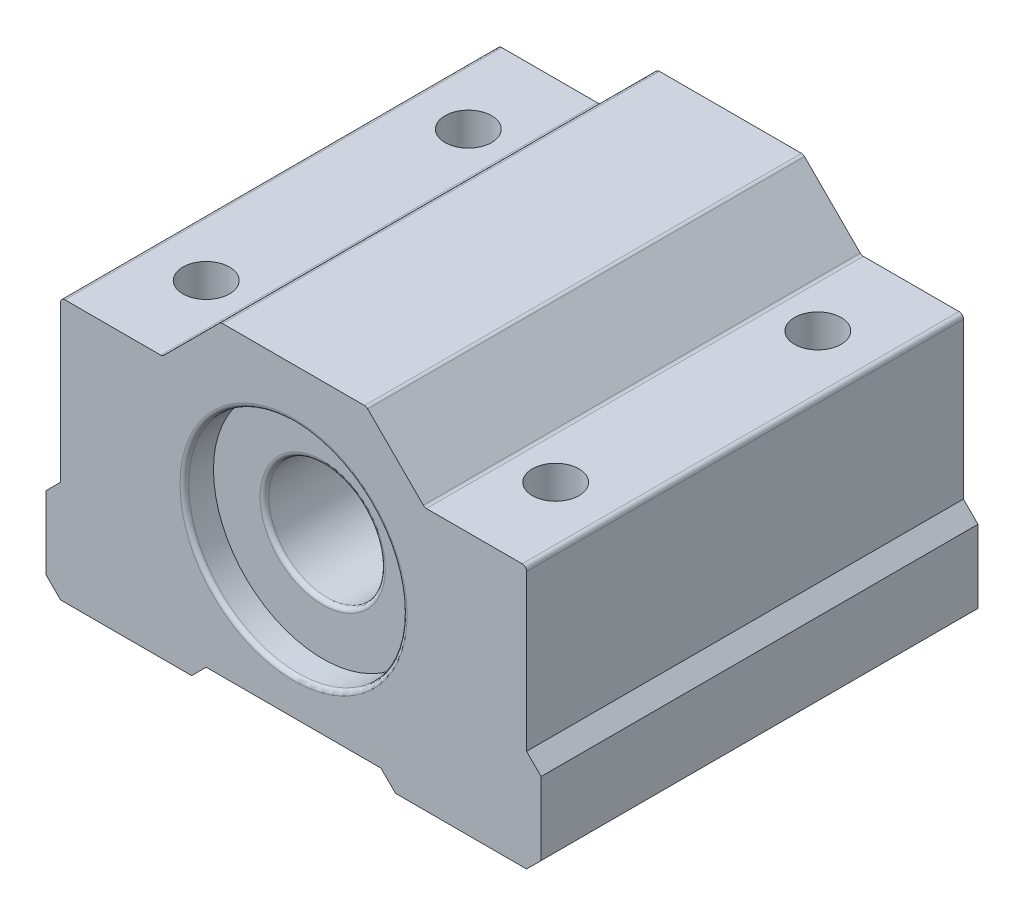
ISO-10303-21;
HEADER;
FILE_DESCRIPTION(('STEP AP214'),'2;1');
FILE_NAME('part.step','',(''),(''),'','','');
FILE_SCHEMA(('AUTOMOTIVE_DESIGN { 1 0 10303 214 1 1 1 1 }'));
ENDSEC;
DATA;
#1=APPLICATION_CONTEXT('core data for automotive mechanical design processes');
#2=APPLICATION_PROTOCOL_DEFINITION('international standard','automotive_design',2000,#1);
#3=PRODUCT_CONTEXT('',#1,'mechanical');
#4=PRODUCT('Part','Part','',(#3));
#5=PRODUCT_RELATED_PRODUCT_CATEGORY('part','',(#4));
#6=PRODUCT_DEFINITION_FORMATION('','',#4);
#7=PRODUCT_DEFINITION_CONTEXT('part definition',#1,'design');
#8=PRODUCT_DEFINITION('design','',#6,#7);
#9=PRODUCT_DEFINITION_SHAPE('','',#8);
#10=(LENGTH_UNIT() NAMED_UNIT(*) SI_UNIT(.MILLI.,.METRE.));
#11=(NAMED_UNIT(*) PLANE_ANGLE_UNIT() SI_UNIT($,.RADIAN.));
#12=(NAMED_UNIT(*) SI_UNIT($,.STERADIAN.) SOLID_ANGLE_UNIT());
#13=UNCERTAINTY_MEASURE_WITH_UNIT(LENGTH_MEASURE(1.E-05),#10,'distance_accuracy_value','');
#14=(GEOMETRIC_REPRESENTATION_CONTEXT(3) GLOBAL_UNCERTAINTY_ASSIGNED_CONTEXT((#13)) GLOBAL_UNIT_ASSIGNED_CONTEXT((#10,
#11,#12)) REPRESENTATION_CONTEXT('',''));
#15=CARTESIAN_POINT('',(0.,0.,0.));
#16=DIRECTION('',(0.,0.,1.));
#17=DIRECTION('',(1.,0.,0.));
#18=AXIS2_PLACEMENT_3D('',#15,#16,#17);
#19=CARTESIAN_POINT('',(0.,11.,15.));
#20=DIRECTION('',(0.,0.,-1.));
#21=DIRECTION('',(-1.,0.,0.));
#22=AXIS2_PLACEMENT_3D('',#19,#20,#21);
#23=CYLINDRICAL_SURFACE('',#22,4.);
#24=CARTESIAN_POINT('',(0.,11.,-12.7));
#25=DIRECTION('',(0.,0.,-1.));
#26=DIRECTION('',(-1.,0.,0.));
#27=AXIS2_PLACEMENT_3D('',#24,#25,#26);
#28=CIRCLE('',#27,4.);
#29=CARTESIAN_POINT('',(-4.,11.,-12.7));
#30=VERTEX_POINT('',#29);
#31=EDGE_CURVE('E356',#30,#30,#28,.T.);
#32=ORIENTED_EDGE('',*,*,#31,.T.);
#33=EDGE_LOOP('',(#32));
#34=FACE_BOUND('',#33,.T.);
#35=CARTESIAN_POINT('',(0.,11.,12.7));
#36=DIRECTION('',(0.,0.,1.));
#37=DIRECTION('',(1.,0.,0.));
#38=AXIS2_PLACEMENT_3D('',#35,#36,#37);
#39=CIRCLE('',#38,4.);
#40=CARTESIAN_POINT('',(4.,11.,12.7));
#41=VERTEX_POINT('',#40);
#42=EDGE_CURVE('E353',#41,#41,#39,.T.);
#43=ORIENTED_EDGE('',*,*,#42,.T.);
#44=EDGE_LOOP('',(#43));
#45=FACE_BOUND('',#44,.T.);
#46=ADVANCED_FACE('F34',(#34,#45),#23,.F.);
#47=CARTESIAN_POINT('',(0.,0.,15.));
#48=DIRECTION('',(0.,0.,1.));
#49=DIRECTION('',(1.,0.,0.));
#50=AXIS2_PLACEMENT_3D('',#47,#48,#49);
#51=PLANE('',#50);
#52=CARTESIAN_POINT('',(0.,11.,15.));
#53=DIRECTION('',(0.,0.,1.));
#54=DIRECTION('',(1.,0.,0.));
#55=AXIS2_PLACEMENT_3D('',#52,#53,#54);
#56=CIRCLE('',#55,7.8);
#57=CARTESIAN_POINT('',(7.8,11.,15.));
#58=VERTEX_POINT('',#57);
#59=EDGE_CURVE('E372',#58,#58,#56,.F.);
#60=ORIENTED_EDGE('',*,*,#59,.T.);
#61=EDGE_LOOP('',(#60));
#62=FACE_BOUND('',#61,.T.);
#63=DIRECTION('',(-0.707106781186548,0.707106781186547,0.));
#64=VECTOR('',#63,1.);
#65=CARTESIAN_POINT('',(9.,18.,15.));
#66=LINE('',#65,#64);
#67=CARTESIAN_POINT('',(8.91213203435596,18.087867965644,15.));
#68=VERTEX_POINT('',#67);
#69=CARTESIAN_POINT('',(5.08786796564404,21.912132034356,15.));
#70=VERTEX_POINT('',#69);
#71=EDGE_CURVE('E231',#68,#70,#66,.T.);
#72=ORIENTED_EDGE('',*,*,#71,.T.);
#73=CARTESIAN_POINT('',(4.87573593128807,21.7,15.));
#74=DIRECTION('',(0.,0.,1.));
#75=DIRECTION('',(1.,0.,0.));
#76=AXIS2_PLACEMENT_3D('',#73,#74,#75);
#77=CIRCLE('',#76,0.3);
#78=CARTESIAN_POINT('',(4.87573593128807,22.,15.));
#79=VERTEX_POINT('',#78);
#80=EDGE_CURVE('E370',#70,#79,#77,.T.);
#81=ORIENTED_EDGE('',*,*,#80,.T.);
#82=DIRECTION('',(-1.,0.,0.));
#83=VECTOR('',#82,1.);
#84=CARTESIAN_POINT('',(-5.,22.,15.));
#85=LINE('',#84,#83);
#86=CARTESIAN_POINT('',(-4.87573593128808,22.,15.));
#87=VERTEX_POINT('',#86);
#88=EDGE_CURVE('E233',#79,#87,#85,.T.);
#89=ORIENTED_EDGE('',*,*,#88,.T.);
#90=CARTESIAN_POINT('',(-4.87573593128808,21.7,15.));
#91=DIRECTION('',(0.,0.,1.));
#92=DIRECTION('',(1.,0.,0.));
#93=AXIS2_PLACEMENT_3D('',#90,#91,#92);
#94=CIRCLE('',#93,0.3);
#95=CARTESIAN_POINT('',(-5.08786796564404,21.912132034356,15.));
#96=VERTEX_POINT('',#95);
#97=EDGE_CURVE('E368',#87,#96,#94,.T.);
#98=ORIENTED_EDGE('',*,*,#97,.T.);
#99=DIRECTION('',(-0.707106781186547,-0.707106781186548,0.));
#100=VECTOR('',#99,1.);
#101=CARTESIAN_POINT('',(-9.,18.,15.));
#102=LINE('',#101,#100);
#103=CARTESIAN_POINT('',(-8.91213203435596,18.087867965644,15.));
#104=VERTEX_POINT('',#103);
#105=EDGE_CURVE('E236',#96,#104,#102,.T.);
#106=ORIENTED_EDGE('',*,*,#105,.T.);
#107=CARTESIAN_POINT('',(-9.12426406871193,18.3,15.));
#108=DIRECTION('',(0.,0.,1.));
#109=DIRECTION('',(1.,0.,0.));
#110=AXIS2_PLACEMENT_3D('',#107,#108,#109);
#111=CIRCLE('',#110,0.3);
#112=CARTESIAN_POINT('',(-9.12426406871193,18.,15.));
#113=VERTEX_POINT('',#112);
#114=EDGE_CURVE('E409',#104,#113,#111,.F.);
#115=ORIENTED_EDGE('',*,*,#114,.T.);
#116=DIRECTION('',(-1.,0.,0.));
#117=VECTOR('',#116,1.);
#118=CARTESIAN_POINT('',(-16.,18.,15.));
#119=LINE('',#118,#117);
#120=CARTESIAN_POINT('',(-15.7,18.,15.));
#121=VERTEX_POINT('',#120);
#122=EDGE_CURVE('E239',#113,#121,#119,.T.);
#123=ORIENTED_EDGE('',*,*,#122,.T.);
#124=CARTESIAN_POINT('',(-15.7,17.7,15.));
#125=DIRECTION('',(0.,0.,1.));
#126=DIRECTION('',(1.,0.,0.));
#127=AXIS2_PLACEMENT_3D('',#124,#125,#126);
#128=CIRCLE('',#127,0.3);
#129=CARTESIAN_POINT('',(-16.,17.7,15.));
#130=VERTEX_POINT('',#129);
#131=EDGE_CURVE('E49',#121,#130,#128,.T.);
#132=ORIENTED_EDGE('',*,*,#131,.T.);
#133=DIRECTION('',(0.,-1.,0.));
#134=VECTOR('',#133,1.);
#135=CARTESIAN_POINT('',(-16.,7.,15.));
#136=LINE('',#135,#134);
#137=CARTESIAN_POINT('',(-16.,7.,15.));
#138=VERTEX_POINT('',#137);
#139=EDGE_CURVE('E241',#130,#138,#136,.T.);
#140=ORIENTED_EDGE('',*,*,#139,.T.);
#141=DIRECTION('',(-0.707106781186547,-0.707106781186547,0.));
#142=VECTOR('',#141,1.);
#143=CARTESIAN_POINT('',(-17.,6.,15.));
#144=LINE('',#143,#142);
#145=CARTESIAN_POINT('',(-17.,6.,15.));
#146=VERTEX_POINT('',#145);
#147=EDGE_CURVE('E243',#138,#146,#144,.T.);
#148=ORIENTED_EDGE('',*,*,#147,.T.);
#149=DIRECTION('',(0.,-1.,0.));
#150=VECTOR('',#149,1.);
#151=CARTESIAN_POINT('',(-17.,0.,15.));
#152=LINE('',#151,#150);
#153=CARTESIAN_POINT('',(-17.,0.999999999999999,15.));
#154=VERTEX_POINT('',#153);
#155=EDGE_CURVE('E245',#146,#154,#152,.T.);
#156=ORIENTED_EDGE('',*,*,#155,.T.);
#157=DIRECTION('',(-0.707106781186548,0.707106781186548,0.));
#158=VECTOR('',#157,1.);
#159=CARTESIAN_POINT('',(-8.,-8.,15.));
#160=LINE('',#159,#158);
#161=CARTESIAN_POINT('',(-16.,0.,15.));
#162=VERTEX_POINT('',#161);
#163=EDGE_CURVE('E331',#154,#162,#160,.F.);
#164=ORIENTED_EDGE('',*,*,#163,.T.);
#165=DIRECTION('',(1.,0.,0.));
#166=VECTOR('',#165,1.);
#167=CARTESIAN_POINT('',(-7.,0.,15.));
#168=LINE('',#167,#166);
#169=CARTESIAN_POINT('',(-7.,0.,15.));
#170=VERTEX_POINT('',#169);
#171=EDGE_CURVE('E248',#162,#170,#168,.T.);
#172=ORIENTED_EDGE('',*,*,#171,.T.);
#173=DIRECTION('',(0.707106781186547,0.707106781186548,0.));
#174=VECTOR('',#173,1.);
#175=CARTESIAN_POINT('',(-6.,1.,15.));
#176=LINE('',#175,#174);
#177=CARTESIAN_POINT('',(-6.,1.,15.));
#178=VERTEX_POINT('',#177);
#179=EDGE_CURVE('E250',#170,#178,#176,.T.);
#180=ORIENTED_EDGE('',*,*,#179,.T.);
#181=DIRECTION('',(1.,0.,0.));
#182=VECTOR('',#181,1.);
#183=CARTESIAN_POINT('',(6.,1.,15.));
#184=LINE('',#183,#182);
#185=CARTESIAN_POINT('',(6.,1.,15.));
#186=VERTEX_POINT('',#185);
#187=EDGE_CURVE('E252',#178,#186,#184,.T.);
#188=ORIENTED_EDGE('',*,*,#187,.T.);
#189=DIRECTION('',(0.707106781186545,-0.70710678118655,0.));
#190=VECTOR('',#189,1.);
#191=CARTESIAN_POINT('',(6.,1.,15.));
#192=LINE('',#191,#190);
#193=CARTESIAN_POINT('',(7.,0.,15.));
#194=VERTEX_POINT('',#193);
#195=EDGE_CURVE('E254',#186,#194,#192,.T.);
#196=ORIENTED_EDGE('',*,*,#195,.T.);
#197=DIRECTION('',(1.,0.,0.));
#198=VECTOR('',#197,1.);
#199=CARTESIAN_POINT('',(7.,0.,15.));
#200=LINE('',#199,#198);
#201=CARTESIAN_POINT('',(16.,0.,15.));
#202=VERTEX_POINT('',#201);
#203=EDGE_CURVE('E208',#194,#202,#200,.T.);
#204=ORIENTED_EDGE('',*,*,#203,.T.);
#205=DIRECTION('',(-0.707106781186548,-0.707106781186548,0.));
#206=VECTOR('',#205,1.);
#207=CARTESIAN_POINT('',(8.,-8.,15.));
#208=LINE('',#207,#206);
#209=CARTESIAN_POINT('',(17.,1.00000000000001,15.));
#210=VERTEX_POINT('',#209);
#211=EDGE_CURVE('E204',#202,#210,#208,.F.);
#212=ORIENTED_EDGE('',*,*,#211,.T.);
#213=DIRECTION('',(0.,1.,0.));
#214=VECTOR('',#213,1.);
#215=CARTESIAN_POINT('',(17.,0.,15.));
#216=LINE('',#215,#214);
#217=CARTESIAN_POINT('',(17.,6.,15.));
#218=VERTEX_POINT('',#217);
#219=EDGE_CURVE('E194',#210,#218,#216,.T.);
#220=ORIENTED_EDGE('',*,*,#219,.T.);
#221=DIRECTION('',(-0.707106781186547,0.707106781186547,0.));
#222=VECTOR('',#221,1.);
#223=CARTESIAN_POINT('',(17.,6.,15.));
#224=LINE('',#223,#222);
#225=CARTESIAN_POINT('',(16.,7.,15.));
#226=VERTEX_POINT('',#225);
#227=EDGE_CURVE('E200',#218,#226,#224,.T.);
#228=ORIENTED_EDGE('',*,*,#227,.T.);
#229=DIRECTION('',(0.,1.,0.));
#230=VECTOR('',#229,1.);
#231=CARTESIAN_POINT('',(16.,7.,15.));
#232=LINE('',#231,#230);
#233=CARTESIAN_POINT('',(16.,17.7,15.));
#234=VERTEX_POINT('',#233);
#235=EDGE_CURVE('E223',#226,#234,#232,.T.);
#236=ORIENTED_EDGE('',*,*,#235,.T.);
#237=CARTESIAN_POINT('',(15.7,17.7,15.));
#238=DIRECTION('',(0.,0.,1.));
#239=DIRECTION('',(1.,0.,0.));
#240=AXIS2_PLACEMENT_3D('',#237,#238,#239);
#241=CIRCLE('',#240,0.3);
#242=CARTESIAN_POINT('',(15.7,18.,15.));
#243=VERTEX_POINT('',#242);
#244=EDGE_CURVE('E366',#234,#243,#241,.T.);
#245=ORIENTED_EDGE('',*,*,#244,.T.);
#246=DIRECTION('',(-1.,0.,0.));
#247=VECTOR('',#246,1.);
#248=CARTESIAN_POINT('',(16.,18.,15.));
#249=LINE('',#248,#247);
#250=CARTESIAN_POINT('',(9.12426406871193,18.,15.));
#251=VERTEX_POINT('',#250);
#252=EDGE_CURVE('E225',#243,#251,#249,.T.);
#253=ORIENTED_EDGE('',*,*,#252,.T.);
#254=CARTESIAN_POINT('',(9.12426406871193,18.3,15.));
#255=DIRECTION('',(0.,0.,1.));
#256=DIRECTION('',(1.,0.,0.));
#257=AXIS2_PLACEMENT_3D('',#254,#255,#256);
#258=CIRCLE('',#257,0.3);
#259=EDGE_CURVE('E11',#251,#68,#258,.F.);
#260=ORIENTED_EDGE('',*,*,#259,.T.);
#261=EDGE_LOOP('',(#72,#81,#89,#98,#106,#115,#123,#132,#140,#148,#156,#164,#172,#180,#188,#196,
#204,#212,#220,#228,#236,#245,#253,#260));
#262=FACE_BOUND('',#261,.T.);
#263=ADVANCED_FACE('F197',(#62,#262),#51,.T.);
#264=CARTESIAN_POINT('',(0.,0.,-15.));
#265=DIRECTION('',(0.,0.,1.));
#266=DIRECTION('',(1.,0.,0.));
#267=AXIS2_PLACEMENT_3D('',#264,#265,#266);
#268=PLANE('',#267);
#269=CARTESIAN_POINT('',(0.,11.,-15.));
#270=DIRECTION('',(0.,0.,1.));
#271=DIRECTION('',(1.,0.,0.));
#272=AXIS2_PLACEMENT_3D('',#269,#270,#271);
#273=CIRCLE('',#272,7.8);
#274=CARTESIAN_POINT('',(7.8,11.,-15.));
#275=VERTEX_POINT('',#274);
#276=EDGE_CURVE('E350',#275,#275,#273,.T.);
#277=ORIENTED_EDGE('',*,*,#276,.T.);
#278=EDGE_LOOP('',(#277));
#279=FACE_BOUND('',#278,.T.);
#280=DIRECTION('',(-1.,0.,0.));
#281=VECTOR('',#280,1.);
#282=CARTESIAN_POINT('',(-5.,22.,-15.));
#283=LINE('',#282,#281);
#284=CARTESIAN_POINT('',(4.87573593128807,22.,-15.));
#285=VERTEX_POINT('',#284);
#286=CARTESIAN_POINT('',(-4.87573593128808,22.,-15.));
#287=VERTEX_POINT('',#286);
#288=EDGE_CURVE('E273',#285,#287,#283,.T.);
#289=ORIENTED_EDGE('',*,*,#288,.F.);
#290=CARTESIAN_POINT('',(4.87573593128807,21.7,-15.));
#291=DIRECTION('',(0.,0.,1.));
#292=DIRECTION('',(1.,0.,0.));
#293=AXIS2_PLACEMENT_3D('',#290,#291,#292);
#294=CIRCLE('',#293,0.3);
#295=CARTESIAN_POINT('',(5.08786796564404,21.912132034356,-15.));
#296=VERTEX_POINT('',#295);
#297=EDGE_CURVE('E348',#285,#296,#294,.F.);
#298=ORIENTED_EDGE('',*,*,#297,.T.);
#299=DIRECTION('',(-0.707106781186548,0.707106781186547,0.));
#300=VECTOR('',#299,1.);
#301=CARTESIAN_POINT('',(9.,18.,-15.));
#302=LINE('',#301,#300);
#303=CARTESIAN_POINT('',(8.91213203435596,18.087867965644,-15.));
#304=VERTEX_POINT('',#303);
#305=EDGE_CURVE('E270',#304,#296,#302,.T.);
#306=ORIENTED_EDGE('',*,*,#305,.F.);
#307=CARTESIAN_POINT('',(9.12426406871193,18.3,-15.));
#308=DIRECTION('',(0.,0.,1.));
#309=DIRECTION('',(1.,0.,0.));
#310=AXIS2_PLACEMENT_3D('',#307,#308,#309);
#311=CIRCLE('',#310,0.3);
#312=CARTESIAN_POINT('',(9.12426406871193,18.,-15.));
#313=VERTEX_POINT('',#312);
#314=EDGE_CURVE('E42',#304,#313,#311,.T.);
#315=ORIENTED_EDGE('',*,*,#314,.T.);
#316=DIRECTION('',(-1.,0.,0.));
#317=VECTOR('',#316,1.);
#318=CARTESIAN_POINT('',(16.,18.,-15.));
#319=LINE('',#318,#317);
#320=CARTESIAN_POINT('',(15.7,18.,-15.));
#321=VERTEX_POINT('',#320);
#322=EDGE_CURVE('E267',#321,#313,#319,.T.);
#323=ORIENTED_EDGE('',*,*,#322,.F.);
#324=CARTESIAN_POINT('',(15.7,17.7,-15.));
#325=DIRECTION('',(0.,0.,1.));
#326=DIRECTION('',(1.,0.,0.));
#327=AXIS2_PLACEMENT_3D('',#324,#325,#326);
#328=CIRCLE('',#327,0.3);
#329=CARTESIAN_POINT('',(16.,17.7,-15.));
#330=VERTEX_POINT('',#329);
#331=EDGE_CURVE('E344',#321,#330,#328,.F.);
#332=ORIENTED_EDGE('',*,*,#331,.T.);
#333=DIRECTION('',(0.,1.,0.));
#334=VECTOR('',#333,1.);
#335=CARTESIAN_POINT('',(16.,7.,-15.));
#336=LINE('',#335,#334);
#337=CARTESIAN_POINT('',(16.,7.,-15.));
#338=VERTEX_POINT('',#337);
#339=EDGE_CURVE('E264',#338,#330,#336,.T.);
#340=ORIENTED_EDGE('',*,*,#339,.F.);
#341=DIRECTION('',(-0.707106781186547,0.707106781186547,0.));
#342=VECTOR('',#341,1.);
#343=CARTESIAN_POINT('',(17.,6.,-15.));
#344=LINE('',#343,#342);
#345=CARTESIAN_POINT('',(17.,6.,-15.));
#346=VERTEX_POINT('',#345);
#347=EDGE_CURVE('E262',#346,#338,#344,.T.);
#348=ORIENTED_EDGE('',*,*,#347,.F.);
#349=DIRECTION('',(0.,1.,0.));
#350=VECTOR('',#349,1.);
#351=CARTESIAN_POINT('',(17.,0.,-15.));
#352=LINE('',#351,#350);
#353=CARTESIAN_POINT('',(17.,1.,-15.));
#354=VERTEX_POINT('',#353);
#355=EDGE_CURVE('E214',#354,#346,#352,.T.);
#356=ORIENTED_EDGE('',*,*,#355,.F.);
#357=DIRECTION('',(0.707106781186548,0.707106781186548,0.));
#358=VECTOR('',#357,1.);
#359=CARTESIAN_POINT('',(17.,1.,-15.));
#360=LINE('',#359,#358);
#361=CARTESIAN_POINT('',(16.,0.,-15.));
#362=VERTEX_POINT('',#361);
#363=EDGE_CURVE('E327',#354,#362,#360,.F.);
#364=ORIENTED_EDGE('',*,*,#363,.T.);
#365=DIRECTION('',(1.,0.,0.));
#366=VECTOR('',#365,1.);
#367=CARTESIAN_POINT('',(7.,0.,-15.));
#368=LINE('',#367,#366);
#369=CARTESIAN_POINT('',(7.,0.,-15.));
#370=VERTEX_POINT('',#369);
#371=EDGE_CURVE('E257',#370,#362,#368,.T.);
#372=ORIENTED_EDGE('',*,*,#371,.F.);
#373=DIRECTION('',(0.707106781186545,-0.70710678118655,0.));
#374=VECTOR('',#373,1.);
#375=CARTESIAN_POINT('',(6.,1.,-15.));
#376=LINE('',#375,#374);
#377=CARTESIAN_POINT('',(6.,1.,-15.));
#378=VERTEX_POINT('',#377);
#379=EDGE_CURVE('E294',#378,#370,#376,.T.);
#380=ORIENTED_EDGE('',*,*,#379,.F.);
#381=DIRECTION('',(1.,0.,0.));
#382=VECTOR('',#381,1.);
#383=CARTESIAN_POINT('',(6.,1.,-15.));
#384=LINE('',#383,#382);
#385=CARTESIAN_POINT('',(-6.,1.,-15.));
#386=VERTEX_POINT('',#385);
#387=EDGE_CURVE('E292',#386,#378,#384,.T.);
#388=ORIENTED_EDGE('',*,*,#387,.F.);
#389=DIRECTION('',(0.707106781186547,0.707106781186548,0.));
#390=VECTOR('',#389,1.);
#391=CARTESIAN_POINT('',(-6.,1.,-15.));
#392=LINE('',#391,#390);
#393=CARTESIAN_POINT('',(-7.,0.,-15.));
#394=VERTEX_POINT('',#393);
#395=EDGE_CURVE('E290',#394,#386,#392,.T.);
#396=ORIENTED_EDGE('',*,*,#395,.F.);
#397=DIRECTION('',(1.,0.,0.));
#398=VECTOR('',#397,1.);
#399=CARTESIAN_POINT('',(-7.,0.,-15.));
#400=LINE('',#399,#398);
#401=CARTESIAN_POINT('',(-16.,0.,-15.));
#402=VERTEX_POINT('',#401);
#403=EDGE_CURVE('E288',#402,#394,#400,.T.);
#404=ORIENTED_EDGE('',*,*,#403,.F.);
#405=DIRECTION('',(0.707106781186548,-0.707106781186548,0.));
#406=VECTOR('',#405,1.);
#407=CARTESIAN_POINT('',(-16.,0.,-15.));
#408=LINE('',#407,#406);
#409=CARTESIAN_POINT('',(-17.,0.999999999999999,-15.));
#410=VERTEX_POINT('',#409);
#411=EDGE_CURVE('E325',#402,#410,#408,.F.);
#412=ORIENTED_EDGE('',*,*,#411,.T.);
#413=DIRECTION('',(0.,-1.,0.));
#414=VECTOR('',#413,1.);
#415=CARTESIAN_POINT('',(-17.,0.,-15.));
#416=LINE('',#415,#414);
#417=CARTESIAN_POINT('',(-17.,6.,-15.));
#418=VERTEX_POINT('',#417);
#419=EDGE_CURVE('E285',#418,#410,#416,.T.);
#420=ORIENTED_EDGE('',*,*,#419,.F.);
#421=DIRECTION('',(-0.707106781186547,-0.707106781186547,0.));
#422=VECTOR('',#421,1.);
#423=CARTESIAN_POINT('',(-17.,6.,-15.));
#424=LINE('',#423,#422);
#425=CARTESIAN_POINT('',(-16.,7.,-15.));
#426=VERTEX_POINT('',#425);
#427=EDGE_CURVE('E283',#426,#418,#424,.T.);
#428=ORIENTED_EDGE('',*,*,#427,.F.);
#429=DIRECTION('',(0.,-1.,0.));
#430=VECTOR('',#429,1.);
#431=CARTESIAN_POINT('',(-16.,7.,-15.));
#432=LINE('',#431,#430);
#433=CARTESIAN_POINT('',(-16.,17.7,-15.));
#434=VERTEX_POINT('',#433);
#435=EDGE_CURVE('E281',#434,#426,#432,.T.);
#436=ORIENTED_EDGE('',*,*,#435,.F.);
#437=CARTESIAN_POINT('',(-15.7,17.7,-15.));
#438=DIRECTION('',(0.,0.,1.));
#439=DIRECTION('',(1.,0.,0.));
#440=AXIS2_PLACEMENT_3D('',#437,#438,#439);
#441=CIRCLE('',#440,0.3);
#442=CARTESIAN_POINT('',(-15.7,18.,-15.));
#443=VERTEX_POINT('',#442);
#444=EDGE_CURVE('E342',#434,#443,#441,.F.);
#445=ORIENTED_EDGE('',*,*,#444,.T.);
#446=DIRECTION('',(-1.,0.,0.));
#447=VECTOR('',#446,1.);
#448=CARTESIAN_POINT('',(-16.,18.,-15.));
#449=LINE('',#448,#447);
#450=CARTESIAN_POINT('',(-9.12426406871193,18.,-15.));
#451=VERTEX_POINT('',#450);
#452=EDGE_CURVE('E279',#451,#443,#449,.T.);
#453=ORIENTED_EDGE('',*,*,#452,.F.);
#454=CARTESIAN_POINT('',(-9.12426406871193,18.3,-15.));
#455=DIRECTION('',(0.,0.,1.));
#456=DIRECTION('',(1.,0.,0.));
#457=AXIS2_PLACEMENT_3D('',#454,#455,#456);
#458=CIRCLE('',#457,0.3);
#459=CARTESIAN_POINT('',(-8.91213203435596,18.087867965644,-15.));
#460=VERTEX_POINT('',#459);
#461=EDGE_CURVE('E407',#451,#460,#458,.T.);
#462=ORIENTED_EDGE('',*,*,#461,.T.);
#463=DIRECTION('',(-0.707106781186547,-0.707106781186548,0.));
#464=VECTOR('',#463,1.);
#465=CARTESIAN_POINT('',(-9.,18.,-15.));
#466=LINE('',#465,#464);
#467=CARTESIAN_POINT('',(-5.08786796564404,21.912132034356,-15.));
#468=VERTEX_POINT('',#467);
#469=EDGE_CURVE('E276',#468,#460,#466,.T.);
#470=ORIENTED_EDGE('',*,*,#469,.F.);
#471=CARTESIAN_POINT('',(-4.87573593128808,21.7,-15.));
#472=DIRECTION('',(0.,0.,1.));
#473=DIRECTION('',(1.,0.,0.));
#474=AXIS2_PLACEMENT_3D('',#471,#472,#473);
#475=CIRCLE('',#474,0.3);
#476=EDGE_CURVE('E346',#468,#287,#475,.F.);
#477=ORIENTED_EDGE('',*,*,#476,.T.);
#478=EDGE_LOOP('',(#289,#298,#306,#315,#323,#332,#340,#348,#356,#364,#372,#380,#388,#396,#404,
#412,#420,#428,#436,#445,#453,#462,#470,#477));
#479=FACE_BOUND('',#478,.T.);
#480=ADVANCED_FACE('F414',(#279,#479),#268,.F.);
#481=CARTESIAN_POINT('',(7.,0.,15.));
#482=DIRECTION('',(0.,1.,0.));
#483=DIRECTION('',(-1.,0.,0.));
#484=AXIS2_PLACEMENT_3D('',#481,#482,#483);
#485=PLANE('',#484);
#486=CARTESIAN_POINT('',(12.,0.,9.));
#487=DIRECTION('',(0.,-1.,0.));
#488=DIRECTION('',(1.,0.,0.));
#489=AXIS2_PLACEMENT_3D('',#486,#487,#488);
#490=CIRCLE('',#489,1.6);
#491=CARTESIAN_POINT('',(13.6,0.,9.));
#492=VERTEX_POINT('',#491);
#493=EDGE_CURVE('E323',#492,#492,#490,.T.);
#494=ORIENTED_EDGE('',*,*,#493,.F.);
#495=EDGE_LOOP('',(#494));
#496=FACE_BOUND('',#495,.T.);
#497=CARTESIAN_POINT('',(12.,0.,-9.));
#498=DIRECTION('',(0.,-1.,0.));
#499=DIRECTION('',(1.,0.,0.));
#500=AXIS2_PLACEMENT_3D('',#497,#498,#499);
#501=CIRCLE('',#500,1.6);
#502=CARTESIAN_POINT('',(13.6,0.,-9.));
#503=VERTEX_POINT('',#502);
#504=EDGE_CURVE('E318',#503,#503,#501,.T.);
#505=ORIENTED_EDGE('',*,*,#504,.F.);
#506=EDGE_LOOP('',(#505));
#507=FACE_BOUND('',#506,.T.);
#508=ORIENTED_EDGE('',*,*,#371,.T.);
#509=DIRECTION('',(0.,0.,1.));
#510=VECTOR('',#509,1.);
#511=CARTESIAN_POINT('',(16.,0.,15.));
#512=LINE('',#511,#510);
#513=EDGE_CURVE('E329',#362,#202,#512,.T.);
#514=ORIENTED_EDGE('',*,*,#513,.T.);
#515=ORIENTED_EDGE('',*,*,#203,.F.);
#516=DIRECTION('',(0.,0.,-1.));
#517=VECTOR('',#516,1.);
#518=CARTESIAN_POINT('',(7.,0.,15.));
#519=LINE('',#518,#517);
#520=EDGE_CURVE('E256',#194,#370,#519,.T.);
#521=ORIENTED_EDGE('',*,*,#520,.T.);
#522=EDGE_LOOP('',(#508,#514,#515,#521));
#523=FACE_BOUND('',#522,.T.);
#524=ADVANCED_FACE('F494',(#496,#507,#523),#485,.F.);
#525=CARTESIAN_POINT('',(17.,0.,15.));
#526=DIRECTION('',(-1.,0.,0.));
#527=DIRECTION('',(0.,0.,1.));
#528=AXIS2_PLACEMENT_3D('',#525,#526,#527);
#529=PLANE('',#528);
#530=ORIENTED_EDGE('',*,*,#219,.F.);
#531=DIRECTION('',(0.,0.,-1.));
#532=VECTOR('',#531,1.);
#533=CARTESIAN_POINT('',(17.,1.,15.));
#534=LINE('',#533,#532);
#535=EDGE_CURVE('E217',#210,#354,#534,.T.);
#536=ORIENTED_EDGE('',*,*,#535,.T.);
#537=ORIENTED_EDGE('',*,*,#355,.T.);
#538=DIRECTION('',(0.,0.,-1.));
#539=VECTOR('',#538,1.);
#540=CARTESIAN_POINT('',(17.,6.,15.));
#541=LINE('',#540,#539);
#542=EDGE_CURVE('E211',#218,#346,#541,.T.);
#543=ORIENTED_EDGE('',*,*,#542,.F.);
#544=EDGE_LOOP('',(#530,#536,#537,#543));
#545=FACE_BOUND('',#544,.T.);
#546=ADVANCED_FACE('F212',(#545),#529,.F.);
#547=CARTESIAN_POINT('',(17.,6.,15.));
#548=DIRECTION('',(-0.707106781186547,-0.707106781186547,0.));
#549=DIRECTION('',(0.707106781186548,-0.707106781186548,0.));
#550=AXIS2_PLACEMENT_3D('',#547,#548,#549);
#551=PLANE('',#550);
#552=ORIENTED_EDGE('',*,*,#347,.T.);
#553=DIRECTION('',(0.,0.,-1.));
#554=VECTOR('',#553,1.);
#555=CARTESIAN_POINT('',(16.,7.,15.));
#556=LINE('',#555,#554);
#557=EDGE_CURVE('E218',#226,#338,#556,.T.);
#558=ORIENTED_EDGE('',*,*,#557,.F.);
#559=ORIENTED_EDGE('',*,*,#227,.F.);
#560=ORIENTED_EDGE('',*,*,#542,.T.);
#561=EDGE_LOOP('',(#552,#558,#559,#560));
#562=FACE_BOUND('',#561,.T.);
#563=ADVANCED_FACE('F220',(#562),#551,.F.);
#564=CARTESIAN_POINT('',(16.,7.,15.));
#565=DIRECTION('',(-1.,0.,0.));
#566=DIRECTION('',(0.,0.,1.));
#567=AXIS2_PLACEMENT_3D('',#564,#565,#566);
#568=PLANE('',#567);
#569=ORIENTED_EDGE('',*,*,#339,.T.);
#570=DIRECTION('',(0.,0.,-1.));
#571=VECTOR('',#570,1.);
#572=CARTESIAN_POINT('',(16.,17.7,15.));
#573=LINE('',#572,#571);
#574=EDGE_CURVE('E402',#330,#234,#573,.F.);
#575=ORIENTED_EDGE('',*,*,#574,.T.);
#576=ORIENTED_EDGE('',*,*,#235,.F.);
#577=ORIENTED_EDGE('',*,*,#557,.T.);
#578=EDGE_LOOP('',(#569,#575,#576,#577));
#579=FACE_BOUND('',#578,.T.);
#580=ADVANCED_FACE('F821',(#579),#568,.F.);
#581=CARTESIAN_POINT('',(16.,18.,15.));
#582=DIRECTION('',(0.,-1.,0.));
#583=DIRECTION('',(0.,0.,-1.));
#584=AXIS2_PLACEMENT_3D('',#581,#582,#583);
#585=PLANE('',#584);
#586=CARTESIAN_POINT('',(12.,18.,9.));
#587=DIRECTION('',(0.,-1.,0.));
#588=DIRECTION('',(0.,0.,-1.));
#589=AXIS2_PLACEMENT_3D('',#586,#587,#588);
#590=CIRCLE('',#589,1.6);
#591=CARTESIAN_POINT('',(12.,18.,7.4));
#592=VERTEX_POINT('',#591);
#593=EDGE_CURVE('E319',#592,#592,#590,.T.);
#594=ORIENTED_EDGE('',*,*,#593,.T.);
#595=EDGE_LOOP('',(#594));
#596=FACE_BOUND('',#595,.T.);
#597=CARTESIAN_POINT('',(12.,18.,-9.));
#598=DIRECTION('',(0.,-1.,0.));
#599=DIRECTION('',(0.,0.,-1.));
#600=AXIS2_PLACEMENT_3D('',#597,#598,#599);
#601=CIRCLE('',#600,1.6);
#602=CARTESIAN_POINT('',(12.,18.,-10.6));
#603=VERTEX_POINT('',#602);
#604=EDGE_CURVE('E314',#603,#603,#601,.T.);
#605=ORIENTED_EDGE('',*,*,#604,.T.);
#606=EDGE_LOOP('',(#605));
#607=FACE_BOUND('',#606,.T.);
#608=ORIENTED_EDGE('',*,*,#322,.T.);
#609=DIRECTION('',(0.,0.,-1.));
#610=VECTOR('',#609,1.);
#611=CARTESIAN_POINT('',(9.12426406871193,18.,15.));
#612=LINE('',#611,#610);
#613=EDGE_CURVE('E400',#313,#251,#612,.F.);
#614=ORIENTED_EDGE('',*,*,#613,.T.);
#615=ORIENTED_EDGE('',*,*,#252,.F.);
#616=DIRECTION('',(0.,0.,-1.));
#617=VECTOR('',#616,1.);
#618=CARTESIAN_POINT('',(15.7,18.,15.));
#619=LINE('',#618,#617);
#620=EDGE_CURVE('E397',#243,#321,#619,.T.);
#621=ORIENTED_EDGE('',*,*,#620,.T.);
#622=EDGE_LOOP('',(#608,#614,#615,#621));
#623=FACE_BOUND('',#622,.T.);
#624=ADVANCED_FACE('F419',(#596,#607,#623),#585,.F.);
#625=CARTESIAN_POINT('',(9.,18.,15.));
#626=DIRECTION('',(-0.707106781186547,-0.707106781186548,0.));
#627=DIRECTION('',(0.707106781186548,-0.707106781186547,0.));
#628=AXIS2_PLACEMENT_3D('',#625,#626,#627);
#629=PLANE('',#628);
#630=ORIENTED_EDGE('',*,*,#305,.T.);
#631=DIRECTION('',(0.,0.,-1.));
#632=VECTOR('',#631,1.);
#633=CARTESIAN_POINT('',(5.08786796564404,21.912132034356,15.));
#634=LINE('',#633,#632);
#635=EDGE_CURVE('E386',#296,#70,#634,.F.);
#636=ORIENTED_EDGE('',*,*,#635,.T.);
#637=ORIENTED_EDGE('',*,*,#71,.F.);
#638=DIRECTION('',(0.,0.,-1.));
#639=VECTOR('',#638,1.);
#640=CARTESIAN_POINT('',(8.91213203435596,18.087867965644,-15.));
#641=LINE('',#640,#639);
#642=EDGE_CURVE('E383',#68,#304,#641,.T.);
#643=ORIENTED_EDGE('',*,*,#642,.T.);
#644=EDGE_LOOP('',(#630,#636,#637,#643));
#645=FACE_BOUND('',#644,.T.);
#646=ADVANCED_FACE('F427',(#645),#629,.F.);
#647=CARTESIAN_POINT('',(-5.,22.,15.));
#648=DIRECTION('',(0.,-1.,0.));
#649=DIRECTION('',(0.,0.,-1.));
#650=AXIS2_PLACEMENT_3D('',#647,#648,#649);
#651=PLANE('',#650);
#652=ORIENTED_EDGE('',*,*,#88,.F.);
#653=DIRECTION('',(0.,0.,-1.));
#654=VECTOR('',#653,1.);
#655=CARTESIAN_POINT('',(4.87573593128807,22.,15.));
#656=LINE('',#655,#654);
#657=EDGE_CURVE('E380',#79,#285,#656,.T.);
#658=ORIENTED_EDGE('',*,*,#657,.T.);
#659=ORIENTED_EDGE('',*,*,#288,.T.);
#660=DIRECTION('',(0.,0.,-1.));
#661=VECTOR('',#660,1.);
#662=CARTESIAN_POINT('',(-4.87573593128808,22.,15.));
#663=LINE('',#662,#661);
#664=EDGE_CURVE('E378',#287,#87,#663,.F.);
#665=ORIENTED_EDGE('',*,*,#664,.T.);
#666=EDGE_LOOP('',(#652,#658,#659,#665));
#667=FACE_BOUND('',#666,.T.);
#668=ADVANCED_FACE('F435',(#667),#651,.F.);
#669=CARTESIAN_POINT('',(-9.,18.,15.));
#670=DIRECTION('',(0.707106781186548,-0.707106781186547,0.));
#671=DIRECTION('',(0.707106781186547,0.707106781186548,0.));
#672=AXIS2_PLACEMENT_3D('',#669,#670,#671);
#673=PLANE('',#672);
#674=ORIENTED_EDGE('',*,*,#105,.F.);
#675=DIRECTION('',(0.,0.,-1.));
#676=VECTOR('',#675,1.);
#677=CARTESIAN_POINT('',(-5.08786796564404,21.912132034356,15.));
#678=LINE('',#677,#676);
#679=EDGE_CURVE('E390',#96,#468,#678,.T.);
#680=ORIENTED_EDGE('',*,*,#679,.T.);
#681=ORIENTED_EDGE('',*,*,#469,.T.);
#682=DIRECTION('',(0.,0.,-1.));
#683=VECTOR('',#682,1.);
#684=CARTESIAN_POINT('',(-8.91213203435596,18.087867965644,15.));
#685=LINE('',#684,#683);
#686=EDGE_CURVE('E388',#460,#104,#685,.F.);
#687=ORIENTED_EDGE('',*,*,#686,.T.);
#688=EDGE_LOOP('',(#674,#680,#681,#687));
#689=FACE_BOUND('',#688,.T.);
#690=ADVANCED_FACE('F443',(#689),#673,.F.);
#691=CARTESIAN_POINT('',(-16.,18.,15.));
#692=DIRECTION('',(0.,-1.,0.));
#693=DIRECTION('',(0.,0.,-1.));
#694=AXIS2_PLACEMENT_3D('',#691,#692,#693);
#695=PLANE('',#694);
#696=CARTESIAN_POINT('',(-12.,18.,9.));
#697=DIRECTION('',(0.,-1.,0.));
#698=DIRECTION('',(0.,0.,-1.));
#699=AXIS2_PLACEMENT_3D('',#696,#697,#698);
#700=CIRCLE('',#699,1.6);
#701=CARTESIAN_POINT('',(-12.,18.,7.4));
#702=VERTEX_POINT('',#701);
#703=EDGE_CURVE('E510',#702,#702,#700,.T.);
#704=ORIENTED_EDGE('',*,*,#703,.T.);
#705=EDGE_LOOP('',(#704));
#706=FACE_BOUND('',#705,.T.);
#707=CARTESIAN_POINT('',(-12.,18.,-9.));
#708=DIRECTION('',(0.,-1.,0.));
#709=DIRECTION('',(0.,0.,-1.));
#710=AXIS2_PLACEMENT_3D('',#707,#708,#709);
#711=CIRCLE('',#710,1.6);
#712=CARTESIAN_POINT('',(-12.,18.,-10.6));
#713=VERTEX_POINT('',#712);
#714=EDGE_CURVE('E503',#713,#713,#711,.T.);
#715=ORIENTED_EDGE('',*,*,#714,.T.);
#716=EDGE_LOOP('',(#715));
#717=FACE_BOUND('',#716,.T.);
#718=ORIENTED_EDGE('',*,*,#122,.F.);
#719=DIRECTION('',(0.,0.,-1.));
#720=VECTOR('',#719,1.);
#721=CARTESIAN_POINT('',(-9.12426406871193,18.,-15.));
#722=LINE('',#721,#720);
#723=EDGE_CURVE('E394',#113,#451,#722,.T.);
#724=ORIENTED_EDGE('',*,*,#723,.T.);
#725=ORIENTED_EDGE('',*,*,#452,.T.);
#726=DIRECTION('',(0.,0.,-1.));
#727=VECTOR('',#726,1.);
#728=CARTESIAN_POINT('',(-15.7,18.,15.));
#729=LINE('',#728,#727);
#730=EDGE_CURVE('E57',#443,#121,#729,.F.);
#731=ORIENTED_EDGE('',*,*,#730,.T.);
#732=EDGE_LOOP('',(#718,#724,#725,#731));
#733=FACE_BOUND('',#732,.T.);
#734=ADVANCED_FACE('F449',(#706,#717,#733),#695,.F.);
#735=CARTESIAN_POINT('',(-16.,7.,15.));
#736=DIRECTION('',(1.,0.,0.));
#737=DIRECTION('',(0.,0.,-1.));
#738=AXIS2_PLACEMENT_3D('',#735,#736,#737);
#739=PLANE('',#738);
#740=ORIENTED_EDGE('',*,*,#139,.F.);
#741=DIRECTION('',(0.,0.,-1.));
#742=VECTOR('',#741,1.);
#743=CARTESIAN_POINT('',(-16.,17.7,15.));
#744=LINE('',#743,#742);
#745=EDGE_CURVE('E404',#130,#434,#744,.T.);
#746=ORIENTED_EDGE('',*,*,#745,.T.);
#747=ORIENTED_EDGE('',*,*,#435,.T.);
#748=DIRECTION('',(0.,0.,-1.));
#749=VECTOR('',#748,1.);
#750=CARTESIAN_POINT('',(-16.,7.,15.));
#751=LINE('',#750,#749);
#752=EDGE_CURVE('E310',#138,#426,#751,.T.);
#753=ORIENTED_EDGE('',*,*,#752,.F.);
#754=EDGE_LOOP('',(#740,#746,#747,#753));
#755=FACE_BOUND('',#754,.T.);
#756=ADVANCED_FACE('F456',(#755),#739,.F.);
#757=CARTESIAN_POINT('',(-17.,6.,15.));
#758=DIRECTION('',(0.707106781186547,-0.707106781186547,0.));
#759=DIRECTION('',(0.707106781186548,0.707106781186548,0.));
#760=AXIS2_PLACEMENT_3D('',#757,#758,#759);
#761=PLANE('',#760);
#762=ORIENTED_EDGE('',*,*,#427,.T.);
#763=DIRECTION('',(0.,0.,-1.));
#764=VECTOR('',#763,1.);
#765=CARTESIAN_POINT('',(-17.,6.,15.));
#766=LINE('',#765,#764);
#767=EDGE_CURVE('E307',#146,#418,#766,.T.);
#768=ORIENTED_EDGE('',*,*,#767,.F.);
#769=ORIENTED_EDGE('',*,*,#147,.F.);
#770=ORIENTED_EDGE('',*,*,#752,.T.);
#771=EDGE_LOOP('',(#762,#768,#769,#770));
#772=FACE_BOUND('',#771,.T.);
#773=ADVANCED_FACE('F463',(#772),#761,.F.);
#774=CARTESIAN_POINT('',(-17.,0.,15.));
#775=DIRECTION('',(1.,0.,0.));
#776=DIRECTION('',(0.,0.,-1.));
#777=AXIS2_PLACEMENT_3D('',#774,#775,#776);
#778=PLANE('',#777);
#779=ORIENTED_EDGE('',*,*,#419,.T.);
#780=DIRECTION('',(0.,0.,1.));
#781=VECTOR('',#780,1.);
#782=CARTESIAN_POINT('',(-17.,0.999999999999999,15.));
#783=LINE('',#782,#781);
#784=EDGE_CURVE('E337',#410,#154,#783,.T.);
#785=ORIENTED_EDGE('',*,*,#784,.T.);
#786=ORIENTED_EDGE('',*,*,#155,.F.);
#787=ORIENTED_EDGE('',*,*,#767,.T.);
#788=EDGE_LOOP('',(#779,#785,#786,#787));
#789=FACE_BOUND('',#788,.T.);
#790=ADVANCED_FACE('F466',(#789),#778,.F.);
#791=CARTESIAN_POINT('',(-7.,0.,15.));
#792=DIRECTION('',(0.,1.,0.));
#793=DIRECTION('',(-1.,0.,0.));
#794=AXIS2_PLACEMENT_3D('',#791,#792,#793);
#795=PLANE('',#794);
#796=CARTESIAN_POINT('',(-12.,0.,9.));
#797=DIRECTION('',(0.,-1.,0.));
#798=DIRECTION('',(-1.,0.,0.));
#799=AXIS2_PLACEMENT_3D('',#796,#797,#798);
#800=CIRCLE('',#799,1.6);
#801=CARTESIAN_POINT('',(-13.6,0.,9.));
#802=VERTEX_POINT('',#801);
#803=EDGE_CURVE('E513',#802,#802,#800,.T.);
#804=ORIENTED_EDGE('',*,*,#803,.F.);
#805=EDGE_LOOP('',(#804));
#806=FACE_BOUND('',#805,.T.);
#807=CARTESIAN_POINT('',(-12.,0.,-9.));
#808=DIRECTION('',(0.,-1.,0.));
#809=DIRECTION('',(-1.,0.,0.));
#810=AXIS2_PLACEMENT_3D('',#807,#808,#809);
#811=CIRCLE('',#810,1.6);
#812=CARTESIAN_POINT('',(-13.6,0.,-9.));
#813=VERTEX_POINT('',#812);
#814=EDGE_CURVE('E322',#813,#813,#811,.T.);
#815=ORIENTED_EDGE('',*,*,#814,.F.);
#816=EDGE_LOOP('',(#815));
#817=FACE_BOUND('',#816,.T.);
#818=ORIENTED_EDGE('',*,*,#171,.F.);
#819=DIRECTION('',(0.,0.,-1.));
#820=VECTOR('',#819,1.);
#821=CARTESIAN_POINT('',(-16.,0.,15.));
#822=LINE('',#821,#820);
#823=EDGE_CURVE('E334',#162,#402,#822,.T.);
#824=ORIENTED_EDGE('',*,*,#823,.T.);
#825=ORIENTED_EDGE('',*,*,#403,.T.);
#826=DIRECTION('',(0.,0.,-1.));
#827=VECTOR('',#826,1.);
#828=CARTESIAN_POINT('',(-7.,0.,15.));
#829=LINE('',#828,#827);
#830=EDGE_CURVE('E304',#170,#394,#829,.T.);
#831=ORIENTED_EDGE('',*,*,#830,.F.);
#832=EDGE_LOOP('',(#818,#824,#825,#831));
#833=FACE_BOUND('',#832,.T.);
#834=ADVANCED_FACE('F474',(#806,#817,#833),#795,.F.);
#835=CARTESIAN_POINT('',(-6.,1.,15.));
#836=DIRECTION('',(-0.707106781186548,0.707106781186547,0.));
#837=DIRECTION('',(-0.707106781186547,-0.707106781186548,0.));
#838=AXIS2_PLACEMENT_3D('',#835,#836,#837);
#839=PLANE('',#838);
#840=ORIENTED_EDGE('',*,*,#395,.T.);
#841=DIRECTION('',(0.,0.,-1.));
#842=VECTOR('',#841,1.);
#843=CARTESIAN_POINT('',(-6.,1.,15.));
#844=LINE('',#843,#842);
#845=EDGE_CURVE('E301',#178,#386,#844,.T.);
#846=ORIENTED_EDGE('',*,*,#845,.F.);
#847=ORIENTED_EDGE('',*,*,#179,.F.);
#848=ORIENTED_EDGE('',*,*,#830,.T.);
#849=EDGE_LOOP('',(#840,#846,#847,#848));
#850=FACE_BOUND('',#849,.T.);
#851=ADVANCED_FACE('F480',(#850),#839,.F.);
#852=CARTESIAN_POINT('',(6.,1.,15.));
#853=DIRECTION('',(0.,1.,0.));
#854=DIRECTION('',(-1.,0.,0.));
#855=AXIS2_PLACEMENT_3D('',#852,#853,#854);
#856=PLANE('',#855);
#857=ORIENTED_EDGE('',*,*,#387,.T.);
#858=DIRECTION('',(0.,0.,-1.));
#859=VECTOR('',#858,1.);
#860=CARTESIAN_POINT('',(6.,1.,15.));
#861=LINE('',#860,#859);
#862=EDGE_CURVE('E298',#186,#378,#861,.T.);
#863=ORIENTED_EDGE('',*,*,#862,.F.);
#864=ORIENTED_EDGE('',*,*,#187,.F.);
#865=ORIENTED_EDGE('',*,*,#845,.T.);
#866=EDGE_LOOP('',(#857,#863,#864,#865));
#867=FACE_BOUND('',#866,.T.);
#868=ADVANCED_FACE('F486',(#867),#856,.F.);
#869=CARTESIAN_POINT('',(6.,1.,15.));
#870=DIRECTION('',(0.70710678118655,0.707106781186546,0.));
#871=DIRECTION('',(-0.707106781186546,0.70710678118655,0.));
#872=AXIS2_PLACEMENT_3D('',#869,#870,#871);
#873=PLANE('',#872);
#874=ORIENTED_EDGE('',*,*,#379,.T.);
#875=ORIENTED_EDGE('',*,*,#520,.F.);
#876=ORIENTED_EDGE('',*,*,#195,.F.);
#877=ORIENTED_EDGE('',*,*,#862,.T.);
#878=EDGE_LOOP('',(#874,#875,#876,#877));
#879=FACE_BOUND('',#878,.T.);
#880=ADVANCED_FACE('F490',(#879),#873,.F.);
#881=CARTESIAN_POINT('',(0.,11.,-13.));
#882=DIRECTION('',(0.,0.,-1.));
#883=DIRECTION('',(-1.,0.,0.));
#884=AXIS2_PLACEMENT_3D('',#881,#882,#883);
#885=CYLINDRICAL_SURFACE('',#884,7.5);
#886=CARTESIAN_POINT('',(0.,11.,-14.7));
#887=DIRECTION('',(0.,0.,1.));
#888=DIRECTION('',(1.,0.,0.));
#889=AXIS2_PLACEMENT_3D('',#886,#887,#888);
#890=CIRCLE('',#889,7.5);
#891=CARTESIAN_POINT('',(7.5,11.,-14.7));
#892=VERTEX_POINT('',#891);
#893=EDGE_CURVE('E339',#892,#892,#890,.F.);
#894=ORIENTED_EDGE('',*,*,#893,.T.);
#895=EDGE_LOOP('',(#894));
#896=FACE_BOUND('',#895,.T.);
#897=CARTESIAN_POINT('',(0.,11.,-13.));
#898=DIRECTION('',(0.,0.,-1.));
#899=DIRECTION('',(-1.,0.,0.));
#900=AXIS2_PLACEMENT_3D('',#897,#898,#899);
#901=CIRCLE('',#900,7.5);
#902=CARTESIAN_POINT('',(-7.5,11.,-13.));
#903=VERTEX_POINT('',#902);
#904=EDGE_CURVE('E260',#903,#903,#901,.T.);
#905=ORIENTED_EDGE('',*,*,#904,.F.);
#906=EDGE_LOOP('',(#905));
#907=FACE_BOUND('',#906,.T.);
#908=ADVANCED_FACE('F552',(#896,#907),#885,.F.);
#909=CARTESIAN_POINT('',(0.,11.,-13.));
#910=DIRECTION('',(0.,0.,-1.));
#911=DIRECTION('',(-1.,0.,0.));
#912=AXIS2_PLACEMENT_3D('',#909,#910,#911);
#913=PLANE('',#912);
#914=CARTESIAN_POINT('',(0.,11.,-13.));
#915=DIRECTION('',(0.,0.,-1.));
#916=DIRECTION('',(-1.,0.,0.));
#917=AXIS2_PLACEMENT_3D('',#914,#915,#916);
#918=CIRCLE('',#917,4.3);
#919=CARTESIAN_POINT('',(-4.3,11.,-13.));
#920=VERTEX_POINT('',#919);
#921=EDGE_CURVE('E359',#920,#920,#918,.F.);
#922=ORIENTED_EDGE('',*,*,#921,.T.);
#923=EDGE_LOOP('',(#922));
#924=FACE_BOUND('',#923,.T.);
#925=ORIENTED_EDGE('',*,*,#904,.T.);
#926=EDGE_LOOP('',(#925));
#927=FACE_BOUND('',#926,.T.);
#928=ADVANCED_FACE('F601',(#924,#927),#913,.T.);
#929=CARTESIAN_POINT('',(0.,11.,13.));
#930=DIRECTION('',(0.,0.,1.));
#931=DIRECTION('',(1.,0.,0.));
#932=AXIS2_PLACEMENT_3D('',#929,#930,#931);
#933=CYLINDRICAL_SURFACE('',#932,7.5);
#934=CARTESIAN_POINT('',(0.,11.,14.7));
#935=DIRECTION('',(0.,0.,1.));
#936=DIRECTION('',(1.,0.,0.));
#937=AXIS2_PLACEMENT_3D('',#934,#935,#936);
#938=CIRCLE('',#937,7.5);
#939=CARTESIAN_POINT('',(7.5,11.,14.7));
#940=VERTEX_POINT('',#939);
#941=EDGE_CURVE('E375',#940,#940,#938,.T.);
#942=ORIENTED_EDGE('',*,*,#941,.T.);
#943=EDGE_LOOP('',(#942));
#944=FACE_BOUND('',#943,.T.);
#945=CARTESIAN_POINT('',(0.,11.,13.));
#946=DIRECTION('',(0.,0.,-1.));
#947=DIRECTION('',(-1.,0.,0.));
#948=AXIS2_PLACEMENT_3D('',#945,#946,#947);
#949=CIRCLE('',#948,7.5);
#950=CARTESIAN_POINT('',(-7.5,11.,13.));
#951=VERTEX_POINT('',#950);
#952=EDGE_CURVE('E317',#951,#951,#949,.T.);
#953=ORIENTED_EDGE('',*,*,#952,.T.);
#954=EDGE_LOOP('',(#953));
#955=FACE_BOUND('',#954,.T.);
#956=ADVANCED_FACE('F608',(#944,#955),#933,.F.);
#957=CARTESIAN_POINT('',(0.,11.,13.));
#958=DIRECTION('',(0.,0.,1.));
#959=DIRECTION('',(-1.,0.,0.));
#960=AXIS2_PLACEMENT_3D('',#957,#958,#959);
#961=PLANE('',#960);
#962=CARTESIAN_POINT('',(0.,11.,13.));
#963=DIRECTION('',(0.,0.,1.));
#964=DIRECTION('',(1.,0.,0.));
#965=AXIS2_PLACEMENT_3D('',#962,#963,#964);
#966=CIRCLE('',#965,4.3);
#967=CARTESIAN_POINT('',(4.3,11.,13.));
#968=VERTEX_POINT('',#967);
#969=EDGE_CURVE('E362',#968,#968,#966,.F.);
#970=ORIENTED_EDGE('',*,*,#969,.T.);
#971=EDGE_LOOP('',(#970));
#972=FACE_BOUND('',#971,.T.);
#973=ORIENTED_EDGE('',*,*,#952,.F.);
#974=EDGE_LOOP('',(#973));
#975=FACE_BOUND('',#974,.T.);
#976=ADVANCED_FACE('F615',(#972,#975),#961,.T.);
#977=CARTESIAN_POINT('',(12.,22.,-9.));
#978=DIRECTION('',(0.,-1.,0.));
#979=DIRECTION('',(1.,0.,0.));
#980=AXIS2_PLACEMENT_3D('',#977,#978,#979);
#981=CYLINDRICAL_SURFACE('',#980,1.6);
#982=ORIENTED_EDGE('',*,*,#504,.T.);
#983=EDGE_LOOP('',(#982));
#984=FACE_BOUND('',#983,.T.);
#985=ORIENTED_EDGE('',*,*,#604,.F.);
#986=EDGE_LOOP('',(#985));
#987=FACE_BOUND('',#986,.T.);
#988=ADVANCED_FACE('F529',(#984,#987),#981,.F.);
#989=CARTESIAN_POINT('',(-12.,22.,-9.));
#990=DIRECTION('',(0.,-1.,0.));
#991=DIRECTION('',(1.,0.,0.));
#992=AXIS2_PLACEMENT_3D('',#989,#990,#991);
#993=CYLINDRICAL_SURFACE('',#992,1.6);
#994=ORIENTED_EDGE('',*,*,#814,.T.);
#995=EDGE_LOOP('',(#994));
#996=FACE_BOUND('',#995,.T.);
#997=ORIENTED_EDGE('',*,*,#714,.F.);
#998=EDGE_LOOP('',(#997));
#999=FACE_BOUND('',#998,.T.);
#1000=ADVANCED_FACE('F525',(#996,#999),#993,.F.);
#1001=CARTESIAN_POINT('',(12.,22.,9.));
#1002=DIRECTION('',(0.,-1.,0.));
#1003=DIRECTION('',(1.,0.,0.));
#1004=AXIS2_PLACEMENT_3D('',#1001,#1002,#1003);
#1005=CYLINDRICAL_SURFACE('',#1004,1.6);
#1006=ORIENTED_EDGE('',*,*,#493,.T.);
#1007=EDGE_LOOP('',(#1006));
#1008=FACE_BOUND('',#1007,.T.);
#1009=ORIENTED_EDGE('',*,*,#593,.F.);
#1010=EDGE_LOOP('',(#1009));
#1011=FACE_BOUND('',#1010,.T.);
#1012=ADVANCED_FACE('F528',(#1008,#1011),#1005,.F.);
#1013=CARTESIAN_POINT('',(-12.,22.,9.));
#1014=DIRECTION('',(0.,-1.,0.));
#1015=DIRECTION('',(1.,0.,0.));
#1016=AXIS2_PLACEMENT_3D('',#1013,#1014,#1015);
#1017=CYLINDRICAL_SURFACE('',#1016,1.6);
#1018=ORIENTED_EDGE('',*,*,#803,.T.);
#1019=EDGE_LOOP('',(#1018));
#1020=FACE_BOUND('',#1019,.T.);
#1021=ORIENTED_EDGE('',*,*,#703,.F.);
#1022=EDGE_LOOP('',(#1021));
#1023=FACE_BOUND('',#1022,.T.);
#1024=ADVANCED_FACE('F517',(#1020,#1023),#1017,.F.);
#1025=CARTESIAN_POINT('',(17.,1.,15.));
#1026=DIRECTION('',(-0.707106781186547,0.707106781186547,0.));
#1027=DIRECTION('',(0.,0.,-1.));
#1028=AXIS2_PLACEMENT_3D('',#1025,#1026,#1027);
#1029=PLANE('',#1028);
#1030=ORIENTED_EDGE('',*,*,#211,.F.);
#1031=ORIENTED_EDGE('',*,*,#513,.F.);
#1032=ORIENTED_EDGE('',*,*,#363,.F.);
#1033=ORIENTED_EDGE('',*,*,#535,.F.);
#1034=EDGE_LOOP('',(#1030,#1031,#1032,#1033));
#1035=FACE_BOUND('',#1034,.T.);
#1036=ADVANCED_FACE('F648',(#1035),#1029,.F.);
#1037=CARTESIAN_POINT('',(-16.,0.,15.));
#1038=DIRECTION('',(0.707106781186547,0.707106781186547,0.));
#1039=DIRECTION('',(0.,0.,-1.));
#1040=AXIS2_PLACEMENT_3D('',#1037,#1038,#1039);
#1041=PLANE('',#1040);
#1042=ORIENTED_EDGE('',*,*,#163,.F.);
#1043=ORIENTED_EDGE('',*,*,#784,.F.);
#1044=ORIENTED_EDGE('',*,*,#411,.F.);
#1045=ORIENTED_EDGE('',*,*,#823,.F.);
#1046=EDGE_LOOP('',(#1042,#1043,#1044,#1045));
#1047=FACE_BOUND('',#1046,.T.);
#1048=ADVANCED_FACE('F469',(#1047),#1041,.F.);
#1049=CARTESIAN_POINT('',(0.,11.,-14.7));
#1050=DIRECTION('',(0.,0.,1.));
#1051=DIRECTION('',(1.,0.,0.));
#1052=AXIS2_PLACEMENT_3D('',#1049,#1050,#1051);
#1053=TOROIDAL_SURFACE('',#1052,7.8,0.3);
#1054=ORIENTED_EDGE('',*,*,#276,.F.);
#1055=EDGE_LOOP('',(#1054));
#1056=FACE_BOUND('',#1055,.T.);
#1057=ORIENTED_EDGE('',*,*,#893,.F.);
#1058=EDGE_LOOP('',(#1057));
#1059=FACE_BOUND('',#1058,.T.);
#1060=ADVANCED_FACE('F662',(#1056,#1059),#1053,.T.);
#1061=CARTESIAN_POINT('',(0.,11.,-12.7));
#1062=DIRECTION('',(0.,0.,-1.));
#1063=DIRECTION('',(-1.,0.,0.));
#1064=AXIS2_PLACEMENT_3D('',#1061,#1062,#1063);
#1065=TOROIDAL_SURFACE('',#1064,4.3,0.3);
#1066=ORIENTED_EDGE('',*,*,#921,.F.);
#1067=EDGE_LOOP('',(#1066));
#1068=FACE_BOUND('',#1067,.T.);
#1069=ORIENTED_EDGE('',*,*,#31,.F.);
#1070=EDGE_LOOP('',(#1069));
#1071=FACE_BOUND('',#1070,.T.);
#1072=ADVANCED_FACE('F668',(#1068,#1071),#1065,.T.);
#1073=CARTESIAN_POINT('',(0.,11.,12.7));
#1074=DIRECTION('',(0.,0.,1.));
#1075=DIRECTION('',(1.,0.,0.));
#1076=AXIS2_PLACEMENT_3D('',#1073,#1074,#1075);
#1077=TOROIDAL_SURFACE('',#1076,4.3,0.3);
#1078=ORIENTED_EDGE('',*,*,#969,.F.);
#1079=EDGE_LOOP('',(#1078));
#1080=FACE_BOUND('',#1079,.T.);
#1081=ORIENTED_EDGE('',*,*,#42,.F.);
#1082=EDGE_LOOP('',(#1081));
#1083=FACE_BOUND('',#1082,.T.);
#1084=ADVANCED_FACE('F676',(#1080,#1083),#1077,.T.);
#1085=CARTESIAN_POINT('',(0.,11.,14.7));
#1086=DIRECTION('',(0.,0.,1.));
#1087=DIRECTION('',(1.,0.,0.));
#1088=AXIS2_PLACEMENT_3D('',#1085,#1086,#1087);
#1089=TOROIDAL_SURFACE('',#1088,7.8,0.3);
#1090=ORIENTED_EDGE('',*,*,#941,.F.);
#1091=EDGE_LOOP('',(#1090));
#1092=FACE_BOUND('',#1091,.T.);
#1093=ORIENTED_EDGE('',*,*,#59,.F.);
#1094=EDGE_LOOP('',(#1093));
#1095=FACE_BOUND('',#1094,.T.);
#1096=ADVANCED_FACE('F684',(#1092,#1095),#1089,.T.);
#1097=CARTESIAN_POINT('',(4.87573593128807,21.7,15.));
#1098=DIRECTION('',(0.,0.,-1.));
#1099=DIRECTION('',(-1.,0.,0.));
#1100=AXIS2_PLACEMENT_3D('',#1097,#1098,#1099);
#1101=CYLINDRICAL_SURFACE('',#1100,0.3);
#1102=ORIENTED_EDGE('',*,*,#80,.F.);
#1103=ORIENTED_EDGE('',*,*,#635,.F.);
#1104=ORIENTED_EDGE('',*,*,#297,.F.);
#1105=ORIENTED_EDGE('',*,*,#657,.F.);
#1106=EDGE_LOOP('',(#1102,#1103,#1104,#1105));
#1107=FACE_BOUND('',#1106,.T.);
#1108=ADVANCED_FACE('F430',(#1107),#1101,.T.);
#1109=CARTESIAN_POINT('',(-4.87573593128808,21.7,15.));
#1110=DIRECTION('',(0.,0.,-1.));
#1111=DIRECTION('',(-1.,0.,0.));
#1112=AXIS2_PLACEMENT_3D('',#1109,#1110,#1111);
#1113=CYLINDRICAL_SURFACE('',#1112,0.3);
#1114=ORIENTED_EDGE('',*,*,#97,.F.);
#1115=ORIENTED_EDGE('',*,*,#664,.F.);
#1116=ORIENTED_EDGE('',*,*,#476,.F.);
#1117=ORIENTED_EDGE('',*,*,#679,.F.);
#1118=EDGE_LOOP('',(#1114,#1115,#1116,#1117));
#1119=FACE_BOUND('',#1118,.T.);
#1120=ADVANCED_FACE('F438',(#1119),#1113,.T.);
#1121=CARTESIAN_POINT('',(-9.12426406871193,18.3,15.));
#1122=DIRECTION('',(0.,0.,1.));
#1123=DIRECTION('',(1.,0.,0.));
#1124=AXIS2_PLACEMENT_3D('',#1121,#1122,#1123);
#1125=CYLINDRICAL_SURFACE('',#1124,0.3);
#1126=ORIENTED_EDGE('',*,*,#114,.F.);
#1127=ORIENTED_EDGE('',*,*,#686,.F.);
#1128=ORIENTED_EDGE('',*,*,#461,.F.);
#1129=ORIENTED_EDGE('',*,*,#723,.F.);
#1130=EDGE_LOOP('',(#1126,#1127,#1128,#1129));
#1131=FACE_BOUND('',#1130,.T.);
#1132=ADVANCED_FACE('F447',(#1131),#1125,.F.);
#1133=CARTESIAN_POINT('',(9.12426406871193,18.3,15.));
#1134=DIRECTION('',(0.,0.,1.));
#1135=DIRECTION('',(1.,0.,0.));
#1136=AXIS2_PLACEMENT_3D('',#1133,#1134,#1135);
#1137=CYLINDRICAL_SURFACE('',#1136,0.3);
#1138=ORIENTED_EDGE('',*,*,#259,.F.);
#1139=ORIENTED_EDGE('',*,*,#613,.F.);
#1140=ORIENTED_EDGE('',*,*,#314,.F.);
#1141=ORIENTED_EDGE('',*,*,#642,.F.);
#1142=EDGE_LOOP('',(#1138,#1139,#1140,#1141));
#1143=FACE_BOUND('',#1142,.T.);
#1144=ADVANCED_FACE('F423',(#1143),#1137,.F.);
#1145=CARTESIAN_POINT('',(15.7,17.7,15.));
#1146=DIRECTION('',(0.,0.,-1.));
#1147=DIRECTION('',(-1.,0.,0.));
#1148=AXIS2_PLACEMENT_3D('',#1145,#1146,#1147);
#1149=CYLINDRICAL_SURFACE('',#1148,0.3);
#1150=ORIENTED_EDGE('',*,*,#244,.F.);
#1151=ORIENTED_EDGE('',*,*,#574,.F.);
#1152=ORIENTED_EDGE('',*,*,#331,.F.);
#1153=ORIENTED_EDGE('',*,*,#620,.F.);
#1154=EDGE_LOOP('',(#1150,#1151,#1152,#1153));
#1155=FACE_BOUND('',#1154,.T.);
#1156=ADVANCED_FACE('F717',(#1155),#1149,.T.);
#1157=CARTESIAN_POINT('',(-15.7,17.7,15.));
#1158=DIRECTION('',(0.,0.,-1.));
#1159=DIRECTION('',(-1.,0.,0.));
#1160=AXIS2_PLACEMENT_3D('',#1157,#1158,#1159);
#1161=CYLINDRICAL_SURFACE('',#1160,0.3);
#1162=ORIENTED_EDGE('',*,*,#131,.F.);
#1163=ORIENTED_EDGE('',*,*,#730,.F.);
#1164=ORIENTED_EDGE('',*,*,#444,.F.);
#1165=ORIENTED_EDGE('',*,*,#745,.F.);
#1166=EDGE_LOOP('',(#1162,#1163,#1164,#1165));
#1167=FACE_BOUND('',#1166,.T.);
#1168=ADVANCED_FACE('F36',(#1167),#1161,.T.);
#1169=CLOSED_SHELL('',(#46,#263,#480,#524,#546,#563,#580,#624,#646,#668,#690,#734,#756,#773,
#790,#834,#851,#868,#880,#908,#928,#956,#976,#988,#1000,#1012,#1024,#1036,#1048,#1060,#1072,
#1084,#1096,#1108,#1120,#1132,#1144,#1156,#1168));
#1170=MANIFOLD_SOLID_BREP('B2',#1169);
#1171=ADVANCED_BREP_SHAPE_REPRESENTATION('',(#18,#1170),#14);
#1172=SHAPE_DEFINITION_REPRESENTATION(#9,#1171);
ENDSEC;
END-ISO-10303-21;
